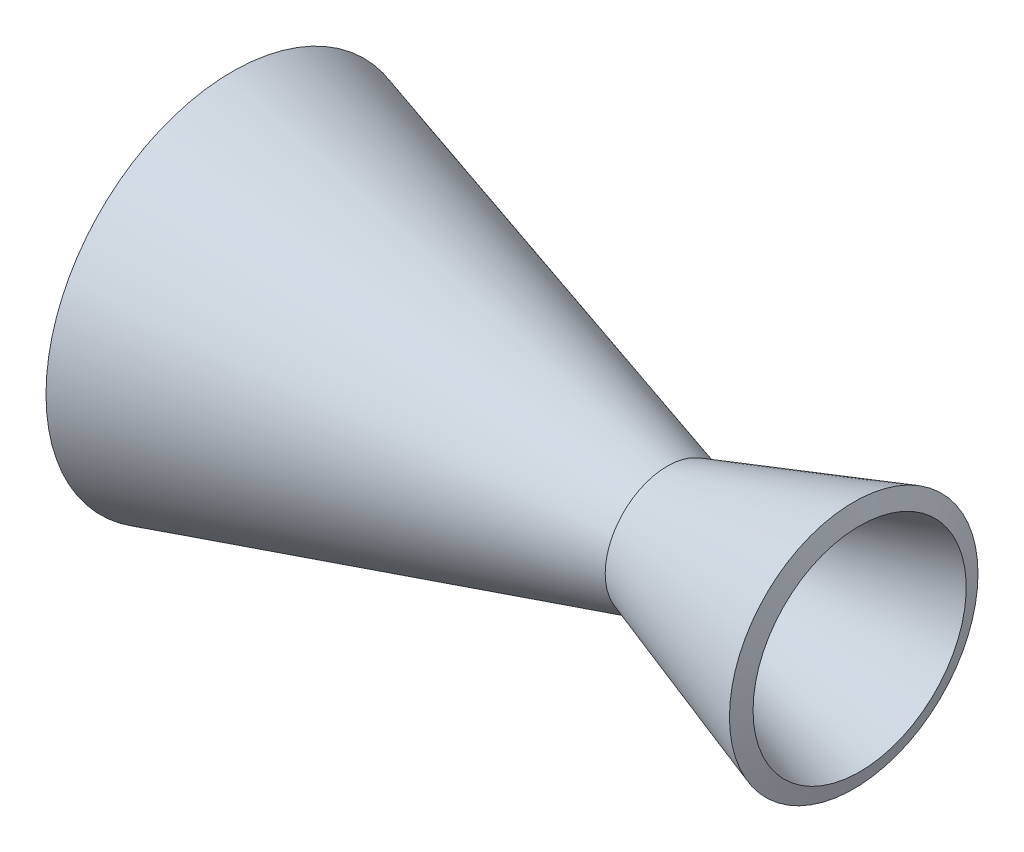
ISO-10303-21;
HEADER;
FILE_DESCRIPTION(('STEP AP214'),'2;1');
FILE_NAME('part.step','',(''),(''),'','','');
FILE_SCHEMA(('AUTOMOTIVE_DESIGN { 1 0 10303 214 1 1 1 1 }'));
ENDSEC;
DATA;
#1=APPLICATION_CONTEXT('core data for automotive mechanical design processes');
#2=APPLICATION_PROTOCOL_DEFINITION('international standard','automotive_design',2000,#1);
#3=PRODUCT_CONTEXT('',#1,'mechanical');
#4=PRODUCT('Part','Part','',(#3));
#5=PRODUCT_RELATED_PRODUCT_CATEGORY('part','',(#4));
#6=PRODUCT_DEFINITION_FORMATION('','',#4);
#7=PRODUCT_DEFINITION_CONTEXT('part definition',#1,'design');
#8=PRODUCT_DEFINITION('design','',#6,#7);
#9=PRODUCT_DEFINITION_SHAPE('','',#8);
#10=(LENGTH_UNIT() NAMED_UNIT(*) SI_UNIT(.MILLI.,.METRE.));
#11=(NAMED_UNIT(*) PLANE_ANGLE_UNIT() SI_UNIT($,.RADIAN.));
#12=(NAMED_UNIT(*) SI_UNIT($,.STERADIAN.) SOLID_ANGLE_UNIT());
#13=UNCERTAINTY_MEASURE_WITH_UNIT(LENGTH_MEASURE(1.E-05),#10,'distance_accuracy_value','');
#14=(GEOMETRIC_REPRESENTATION_CONTEXT(3) GLOBAL_UNCERTAINTY_ASSIGNED_CONTEXT((#13)) GLOBAL_UNIT_ASSIGNED_CONTEXT((#10,
#11,#12)) REPRESENTATION_CONTEXT('',''));
#15=CARTESIAN_POINT('',(0.,0.,0.));
#16=DIRECTION('',(0.,0.,1.));
#17=DIRECTION('',(1.,0.,0.));
#18=AXIS2_PLACEMENT_3D('',#15,#16,#17);
#19=CARTESIAN_POINT('',(70.0682186046163,0.,0.));
#20=DIRECTION('',(1.,0.,0.));
#21=DIRECTION('',(0.,0.,-1.));
#22=AXIS2_PLACEMENT_3D('',#19,#20,#21);
#23=CONICAL_SURFACE('',#22,6.8604618747037,0.321750554396642);
#24=CARTESIAN_POINT('',(100.948683298051,0.,0.));
#25=DIRECTION('',(-1.,0.,0.));
#26=DIRECTION('',(0.,0.,1.));
#27=AXIS2_PLACEMENT_3D('',#24,#25,#26);
#28=CIRCLE('',#27,17.1539501058485);
#29=CARTESIAN_POINT('',(100.948683298051,0.,17.1539501058485));
#30=VERTEX_POINT('',#29);
#31=EDGE_CURVE('E67',#30,#30,#28,.T.);
#32=ORIENTED_EDGE('',*,*,#31,.F.);
#33=EDGE_LOOP('',(#32));
#34=FACE_BOUND('',#33,.T.);
#35=CARTESIAN_POINT('',(70.0682186046163,0.,0.));
#36=DIRECTION('',(-1.,0.,0.));
#37=DIRECTION('',(0.,0.,1.));
#38=AXIS2_PLACEMENT_3D('',#35,#36,#37);
#39=CIRCLE('',#38,6.8604618747037);
#40=CARTESIAN_POINT('',(70.0682186046163,0.,6.8604618747037));
#41=VERTEX_POINT('',#40);
#42=EDGE_CURVE('E10',#41,#41,#39,.T.);
#43=ORIENTED_EDGE('',*,*,#42,.T.);
#44=EDGE_LOOP('',(#43));
#45=FACE_BOUND('',#44,.T.);
#46=ADVANCED_FACE('F43',(#34,#45),#23,.F.);
#47=CARTESIAN_POINT('',(-0.824163383692134,0.,0.));
#48=DIRECTION('',(-1.,0.,0.));
#49=DIRECTION('',(0.,0.,1.));
#50=AXIS2_PLACEMENT_3D('',#47,#48,#49);
#51=CONICAL_SURFACE('',#50,27.1154281570775,0.278299659005111);
#52=CARTESIAN_POINT('',(-0.824163383692134,0.,0.));
#53=DIRECTION('',(-1.,0.,0.));
#54=DIRECTION('',(0.,0.,1.));
#55=AXIS2_PLACEMENT_3D('',#52,#53,#54);
#56=CIRCLE('',#55,27.1154281570775);
#57=CARTESIAN_POINT('',(-0.824163383692134,0.,27.1154281570775));
#58=VERTEX_POINT('',#57);
#59=EDGE_CURVE('E49',#58,#58,#56,.T.);
#60=CARTESIAN_POINT('',(70.0682186046163,0.,6.8604618747037));
#61=CARTESIAN_POINT('',(69.3297562922381,0.,7.07145110681175));
#62=CARTESIAN_POINT('',(68.5912939798599,0.,7.28244033891982));
#63=CARTESIAN_POINT('',(67.1143693551034,0.,7.70441880313594));
#64=CARTESIAN_POINT('',(66.3759070427252,0.,7.915408035244));
#65=CARTESIAN_POINT('',(64.8989824179688,0.,8.33738649946013));
#66=CARTESIAN_POINT('',(64.1605201055906,0.,8.54837573156819));
#67=CARTESIAN_POINT('',(62.6835954808341,0.,8.9703541957843));
#68=CARTESIAN_POINT('',(61.9451331684559,0.,9.18134342789237));
#69=CARTESIAN_POINT('',(60.4682085436995,0.,9.60332189210849));
#70=CARTESIAN_POINT('',(59.7297462313213,0.,9.81431112421655));
#71=CARTESIAN_POINT('',(58.2528216065649,0.,10.2362895884327));
#72=CARTESIAN_POINT('',(57.5143592941867,0.,10.4472788205407));
#73=CARTESIAN_POINT('',(56.0374346694302,0.,10.8692572847569));
#74=CARTESIAN_POINT('',(55.298972357052,0.,11.0802465168649));
#75=CARTESIAN_POINT('',(53.8220477322956,0.,11.502224981081));
#76=CARTESIAN_POINT('',(53.0835854199174,0.,11.7132142131891));
#77=CARTESIAN_POINT('',(51.606660795161,0.,12.1351926774052));
#78=CARTESIAN_POINT('',(50.8681984827827,0.,12.3461819095133));
#79=CARTESIAN_POINT('',(49.3912738580263,0.,12.7681603737294));
#80=CARTESIAN_POINT('',(48.6528115456481,0.,12.9791496058375));
#81=CARTESIAN_POINT('',(47.1758869208917,0.,13.4011280700536));
#82=CARTESIAN_POINT('',(46.4374246085135,0.,13.6121173021616));
#83=CARTESIAN_POINT('',(44.960499983757,0.,14.0340957663778));
#84=CARTESIAN_POINT('',(44.2220376713788,0.,14.2450849984858));
#85=CARTESIAN_POINT('',(42.7451130466224,0.,14.6670634627019));
#86=CARTESIAN_POINT('',(42.0066507342442,0.,14.87805269481));
#87=CARTESIAN_POINT('',(40.5297261094878,0.,15.3000311590261));
#88=CARTESIAN_POINT('',(39.7912637971096,0.,15.5110203911342));
#89=CARTESIAN_POINT('',(38.3143391723531,0.,15.9329988553503));
#90=CARTESIAN_POINT('',(37.5758768599749,0.,16.1439880874584));
#91=CARTESIAN_POINT('',(36.0989522352185,0.,16.5659665516745));
#92=CARTESIAN_POINT('',(35.3604899228403,0.,16.7769557837826));
#93=CARTESIAN_POINT('',(33.8835652980839,0.,17.1989342479987));
#94=CARTESIAN_POINT('',(33.1451029857056,0.,17.4099234801067));
#95=CARTESIAN_POINT('',(31.6681783609492,0.,17.8319019443229));
#96=CARTESIAN_POINT('',(30.929716048571,0.,18.0428911764309));
#97=CARTESIAN_POINT('',(29.4527914238146,0.,18.464869640647));
#98=CARTESIAN_POINT('',(28.7143291114364,0.,18.6758588727551));
#99=CARTESIAN_POINT('',(27.2374044866799,0.,19.0978373369712));
#100=CARTESIAN_POINT('',(26.4989421743017,0.,19.3088265690793));
#101=CARTESIAN_POINT('',(25.0220175495453,0.,19.7308050332954));
#102=CARTESIAN_POINT('',(24.2835552371671,0.,19.9417942654035));
#103=CARTESIAN_POINT('',(22.8066306124107,0.,20.3637727296196));
#104=CARTESIAN_POINT('',(22.0681683000325,0.,20.5747619617276));
#105=CARTESIAN_POINT('',(20.591243675276,0.,20.9967404259438));
#106=CARTESIAN_POINT('',(19.8527813628978,0.,21.2077296580518));
#107=CARTESIAN_POINT('',(18.3758567381414,0.,21.6297081222679));
#108=CARTESIAN_POINT('',(17.6373944257632,0.,21.840697354376));
#109=CARTESIAN_POINT('',(16.1604698010068,0.,22.2626758185921));
#110=CARTESIAN_POINT('',(15.4220074886285,0.,22.4736650507002));
#111=CARTESIAN_POINT('',(13.9450828638721,0.,22.8956435149163));
#112=CARTESIAN_POINT('',(13.2066205514939,0.,23.1066327470244));
#113=CARTESIAN_POINT('',(11.7296959267375,0.,23.5286112112405));
#114=CARTESIAN_POINT('',(10.9912336143593,0.,23.7396004433486));
#115=CARTESIAN_POINT('',(9.51430898960284,0.,24.1615789075647));
#116=CARTESIAN_POINT('',(8.77584667722463,0.,24.3725681396727));
#117=CARTESIAN_POINT('',(7.2989220524682,0.,24.7945466038889));
#118=CARTESIAN_POINT('',(6.56045974008999,0.,25.0055358359969));
#119=CARTESIAN_POINT('',(5.08353511533357,0.,25.427514300213));
#120=CARTESIAN_POINT('',(4.34507280295536,0.,25.6385035323211));
#121=CARTESIAN_POINT('',(2.86814817819893,0.,26.0604819965372));
#122=CARTESIAN_POINT('',(2.12968586582072,0.,26.2714712286453));
#123=CARTESIAN_POINT('',(0.652761241064288,0.,26.6934496928614));
#124=CARTESIAN_POINT('',(-0.0857010713139232,0.,26.9044389249695));
#125=CARTESIAN_POINT('',(-0.824163383692134,0.,27.1154281570775));
#126=B_SPLINE_CURVE_WITH_KNOTS('',3,(#60,#61,#62,#63,#64,#65,#66,#67,#68,#69,#70,#71,#72,#73,
#74,#75,#76,#77,#78,#79,#80,#81,#82,#83,#84,#85,#86,#87,#88,#89,#90,#91,#92,#93,#94,#95,#96,#97,
#98,#99,#100,#101,#102,#103,#104,#105,#106,#107,#108,#109,#110,#111,#112,#113,#114,#115,#116,
#117,#118,#119,#120,#121,#122,#123,#124,#125),.UNSPECIFIED.,.F.,.F.,(4,2,2,2,2,2,2,2,2,2,2,2,2,
2,2,2,2,2,2,2,2,2,2,2,2,2,2,2,2,2,2,2,4),(0.,2.30403719280239,4.60807438560479,6.91211157840718,
9.21614877120957,11.520185964012,13.8242231568144,16.1282603496167,18.4322975424191,
20.7363347352215,23.0403719280239,25.3444091208263,27.6484463136287,29.9524835064311,
32.2565206992335,34.5605578920359,36.8645950848383,39.1686322776407,41.4726694704431,
43.7767066632455,46.0807438560479,48.3847810488502,50.6888182416526,52.992855434455,
55.2968926272574,57.6009298200598,59.9049670128622,62.2090042056646,64.513041398467,
66.8170785912694,69.1211157840718,71.4251529768742,73.7291901696766),.UNSPECIFIED.);
#127=EDGE_CURVE('BSEAM78',#41,#58,#126,.T.);
#128=ORIENTED_EDGE('',*,*,#42,.F.);
#129=ORIENTED_EDGE('',*,*,#59,.T.);
#130=ORIENTED_EDGE('',*,*,#127,.T.);
#131=ORIENTED_EDGE('',*,*,#127,.F.);
#132=EDGE_LOOP('',(#128,#130,#129,#131));
#133=FACE_BOUND('',#132,.T.);
#134=ADVANCED_FACE('F78',(#133),#51,.F.);
#135=CARTESIAN_POINT('',(-0.824163383692134,0.,0.));
#136=DIRECTION('',(1.,0.,0.));
#137=DIRECTION('',(0.,0.,-1.));
#138=AXIS2_PLACEMENT_3D('',#135,#136,#137);
#139=CONICAL_SURFACE('',#138,27.1154281570775,1.29249666778979);
#140=CARTESIAN_POINT('',(0.,0.,0.));
#141=DIRECTION('',(-1.,0.,0.));
#142=DIRECTION('',(0.,0.,1.));
#143=AXIS2_PLACEMENT_3D('',#140,#141,#142);
#144=CIRCLE('',#143,30.);
#145=CARTESIAN_POINT('',(0.,0.,30.));
#146=VERTEX_POINT('',#145);
#147=EDGE_CURVE('E54',#146,#146,#144,.T.);
#148=ORIENTED_EDGE('',*,*,#147,.T.);
#149=EDGE_LOOP('',(#148));
#150=FACE_BOUND('',#149,.T.);
#151=ORIENTED_EDGE('',*,*,#59,.F.);
#152=EDGE_LOOP('',(#151));
#153=FACE_BOUND('',#152,.T.);
#154=ADVANCED_FACE('F81',(#150,#153),#139,.T.);
#155=CARTESIAN_POINT('',(0.,0.,0.));
#156=DIRECTION('',(-1.,0.,0.));
#157=DIRECTION('',(0.,0.,1.));
#158=AXIS2_PLACEMENT_3D('',#155,#156,#157);
#159=CONICAL_SURFACE('',#158,30.,0.278299659005111);
#160=CARTESIAN_POINT('',(70.,0.,0.));
#161=DIRECTION('',(-1.,0.,0.));
#162=DIRECTION('',(0.,0.,1.));
#163=AXIS2_PLACEMENT_3D('',#160,#161,#162);
#164=CIRCLE('',#163,10.);
#165=CARTESIAN_POINT('',(70.,0.,10.));
#166=VERTEX_POINT('',#165);
#167=EDGE_CURVE('E58',#166,#166,#164,.T.);
#168=CARTESIAN_POINT('',(70.,0.,10.));
#169=CARTESIAN_POINT('',(69.2708333333333,0.,10.2083333333333));
#170=CARTESIAN_POINT('',(68.5416666666667,0.,10.4166666666667));
#171=CARTESIAN_POINT('',(67.0833333333333,0.,10.8333333333333));
#172=CARTESIAN_POINT('',(66.3541666666667,0.,11.0416666666667));
#173=CARTESIAN_POINT('',(64.8958333333333,0.,11.4583333333333));
#174=CARTESIAN_POINT('',(64.1666666666667,0.,11.6666666666667));
#175=CARTESIAN_POINT('',(62.7083333333333,0.,12.0833333333333));
#176=CARTESIAN_POINT('',(61.9791666666667,0.,12.2916666666667));
#177=CARTESIAN_POINT('',(60.5208333333333,0.,12.7083333333333));
#178=CARTESIAN_POINT('',(59.7916666666667,0.,12.9166666666667));
#179=CARTESIAN_POINT('',(58.3333333333333,0.,13.3333333333333));
#180=CARTESIAN_POINT('',(57.6041666666667,0.,13.5416666666667));
#181=CARTESIAN_POINT('',(56.1458333333333,0.,13.9583333333333));
#182=CARTESIAN_POINT('',(55.4166666666667,0.,14.1666666666667));
#183=CARTESIAN_POINT('',(53.9583333333333,0.,14.5833333333333));
#184=CARTESIAN_POINT('',(53.2291666666667,0.,14.7916666666667));
#185=CARTESIAN_POINT('',(51.7708333333333,0.,15.2083333333333));
#186=CARTESIAN_POINT('',(51.0416666666667,0.,15.4166666666667));
#187=CARTESIAN_POINT('',(49.5833333333333,0.,15.8333333333333));
#188=CARTESIAN_POINT('',(48.8541666666667,0.,16.0416666666667));
#189=CARTESIAN_POINT('',(47.3958333333333,0.,16.4583333333333));
#190=CARTESIAN_POINT('',(46.6666666666667,0.,16.6666666666667));
#191=CARTESIAN_POINT('',(45.2083333333333,0.,17.0833333333333));
#192=CARTESIAN_POINT('',(44.4791666666667,0.,17.2916666666667));
#193=CARTESIAN_POINT('',(43.0208333333333,0.,17.7083333333333));
#194=CARTESIAN_POINT('',(42.2916666666667,0.,17.9166666666667));
#195=CARTESIAN_POINT('',(40.8333333333333,0.,18.3333333333333));
#196=CARTESIAN_POINT('',(40.1041666666667,0.,18.5416666666667));
#197=CARTESIAN_POINT('',(38.6458333333333,0.,18.9583333333333));
#198=CARTESIAN_POINT('',(37.9166666666667,0.,19.1666666666667));
#199=CARTESIAN_POINT('',(36.4583333333333,0.,19.5833333333333));
#200=CARTESIAN_POINT('',(35.7291666666667,0.,19.7916666666667));
#201=CARTESIAN_POINT('',(34.2708333333333,0.,20.2083333333333));
#202=CARTESIAN_POINT('',(33.5416666666667,0.,20.4166666666667));
#203=CARTESIAN_POINT('',(32.0833333333333,0.,20.8333333333333));
#204=CARTESIAN_POINT('',(31.3541666666667,0.,21.0416666666667));
#205=CARTESIAN_POINT('',(29.8958333333333,0.,21.4583333333333));
#206=CARTESIAN_POINT('',(29.1666666666667,0.,21.6666666666667));
#207=CARTESIAN_POINT('',(27.7083333333333,0.,22.0833333333333));
#208=CARTESIAN_POINT('',(26.9791666666667,0.,22.2916666666667));
#209=CARTESIAN_POINT('',(25.5208333333333,0.,22.7083333333333));
#210=CARTESIAN_POINT('',(24.7916666666667,0.,22.9166666666667));
#211=CARTESIAN_POINT('',(23.3333333333333,0.,23.3333333333333));
#212=CARTESIAN_POINT('',(22.6041666666667,0.,23.5416666666667));
#213=CARTESIAN_POINT('',(21.1458333333333,0.,23.9583333333333));
#214=CARTESIAN_POINT('',(20.4166666666667,0.,24.1666666666667));
#215=CARTESIAN_POINT('',(18.9583333333333,0.,24.5833333333333));
#216=CARTESIAN_POINT('',(18.2291666666667,0.,24.7916666666667));
#217=CARTESIAN_POINT('',(16.7708333333333,0.,25.2083333333333));
#218=CARTESIAN_POINT('',(16.0416666666667,0.,25.4166666666667));
#219=CARTESIAN_POINT('',(14.5833333333333,0.,25.8333333333333));
#220=CARTESIAN_POINT('',(13.8541666666667,0.,26.0416666666667));
#221=CARTESIAN_POINT('',(12.3958333333333,0.,26.4583333333333));
#222=CARTESIAN_POINT('',(11.6666666666667,0.,26.6666666666667));
#223=CARTESIAN_POINT('',(10.2083333333333,0.,27.0833333333333));
#224=CARTESIAN_POINT('',(9.47916666666667,0.,27.2916666666667));
#225=CARTESIAN_POINT('',(8.02083333333333,0.,27.7083333333333));
#226=CARTESIAN_POINT('',(7.29166666666667,0.,27.9166666666667));
#227=CARTESIAN_POINT('',(5.83333333333333,0.,28.3333333333333));
#228=CARTESIAN_POINT('',(5.10416666666667,0.,28.5416666666667));
#229=CARTESIAN_POINT('',(3.64583333333333,0.,28.9583333333333));
#230=CARTESIAN_POINT('',(2.91666666666666,0.,29.1666666666667));
#231=CARTESIAN_POINT('',(1.45833333333333,0.,29.5833333333333));
#232=CARTESIAN_POINT('',(0.729166666666665,0.,29.7916666666667));
#233=CARTESIAN_POINT('',(0.,0.,30.));
#234=B_SPLINE_CURVE_WITH_KNOTS('',3,(#168,#169,#170,#171,#172,#173,#174,#175,#176,#177,#178,
#179,#180,#181,#182,#183,#184,#185,#186,#187,#188,#189,#190,#191,#192,#193,#194,#195,#196,#197,
#198,#199,#200,#201,#202,#203,#204,#205,#206,#207,#208,#209,#210,#211,#212,#213,#214,#215,#216,
#217,#218,#219,#220,#221,#222,#223,#224,#225,#226,#227,#228,#229,#230,#231,#232,#233),
.UNSPECIFIED.,.F.,.F.,(4,2,2,2,2,2,2,2,2,2,2,2,2,2,2,2,2,2,2,2,2,2,2,2,2,2,2,2,2,2,2,2,4),(0.,
2.27503434040016,4.55006868080033,6.82510302120049,9.10013736160065,11.3751717020008,
13.650206042401,15.9252403828011,18.2002747232013,20.4753090636015,22.7503434040016,
25.0253777444018,27.300412084802,29.5754464252021,31.8504807656023,34.1255151060024,
36.4005494464026,38.6755837868028,40.9506181272029,43.2256524676031,45.5006868080032,
47.7757211484034,50.0507554888036,52.3257898292037,54.6008241696039,56.875858510004,
59.1508928504042,61.4259271908044,63.7009615312045,65.9759958716047,68.2510302120048,
70.526064552405,72.8010988928052),.UNSPECIFIED.);
#235=EDGE_CURVE('BSEAM86',#166,#146,#234,.T.);
#236=ORIENTED_EDGE('',*,*,#167,.T.);
#237=ORIENTED_EDGE('',*,*,#147,.F.);
#238=ORIENTED_EDGE('',*,*,#235,.T.);
#239=ORIENTED_EDGE('',*,*,#235,.F.);
#240=EDGE_LOOP('',(#236,#238,#237,#239));
#241=FACE_BOUND('',#240,.T.);
#242=ADVANCED_FACE('F86',(#241),#159,.T.);
#243=CARTESIAN_POINT('',(70.,0.,0.));
#244=DIRECTION('',(1.,0.,0.));
#245=DIRECTION('',(0.,0.,-1.));
#246=AXIS2_PLACEMENT_3D('',#243,#244,#245);
#247=CONICAL_SURFACE('',#246,10.,0.321750554396642);
#248=CARTESIAN_POINT('',(100.,0.,0.));
#249=DIRECTION('',(-1.,0.,0.));
#250=DIRECTION('',(0.,0.,1.));
#251=AXIS2_PLACEMENT_3D('',#248,#249,#250);
#252=CIRCLE('',#251,20.);
#253=CARTESIAN_POINT('',(100.,0.,20.));
#254=VERTEX_POINT('',#253);
#255=EDGE_CURVE('E68',#254,#254,#252,.T.);
#256=ORIENTED_EDGE('',*,*,#255,.T.);
#257=EDGE_LOOP('',(#256));
#258=FACE_BOUND('',#257,.T.);
#259=ORIENTED_EDGE('',*,*,#167,.F.);
#260=EDGE_LOOP('',(#259));
#261=FACE_BOUND('',#260,.T.);
#262=ADVANCED_FACE('F94',(#258,#261),#247,.T.);
#263=CARTESIAN_POINT('',(100.,0.,0.));
#264=DIRECTION('',(-1.,0.,0.));
#265=DIRECTION('',(0.,0.,1.));
#266=AXIS2_PLACEMENT_3D('',#263,#264,#265);
#267=CONICAL_SURFACE('',#266,20.,1.24904577239825);
#268=ORIENTED_EDGE('',*,*,#31,.T.);
#269=EDGE_LOOP('',(#268));
#270=FACE_BOUND('',#269,.T.);
#271=ORIENTED_EDGE('',*,*,#255,.F.);
#272=EDGE_LOOP('',(#271));
#273=FACE_BOUND('',#272,.T.);
#274=ADVANCED_FACE('F73',(#270,#273),#267,.T.);
#275=CLOSED_SHELL('',(#46,#134,#154,#242,#262,#274));
#276=MANIFOLD_SOLID_BREP('B2',#275);
#277=ADVANCED_BREP_SHAPE_REPRESENTATION('',(#18,#276),#14);
#278=SHAPE_DEFINITION_REPRESENTATION(#9,#277);
ENDSEC;
END-ISO-10303-21;
